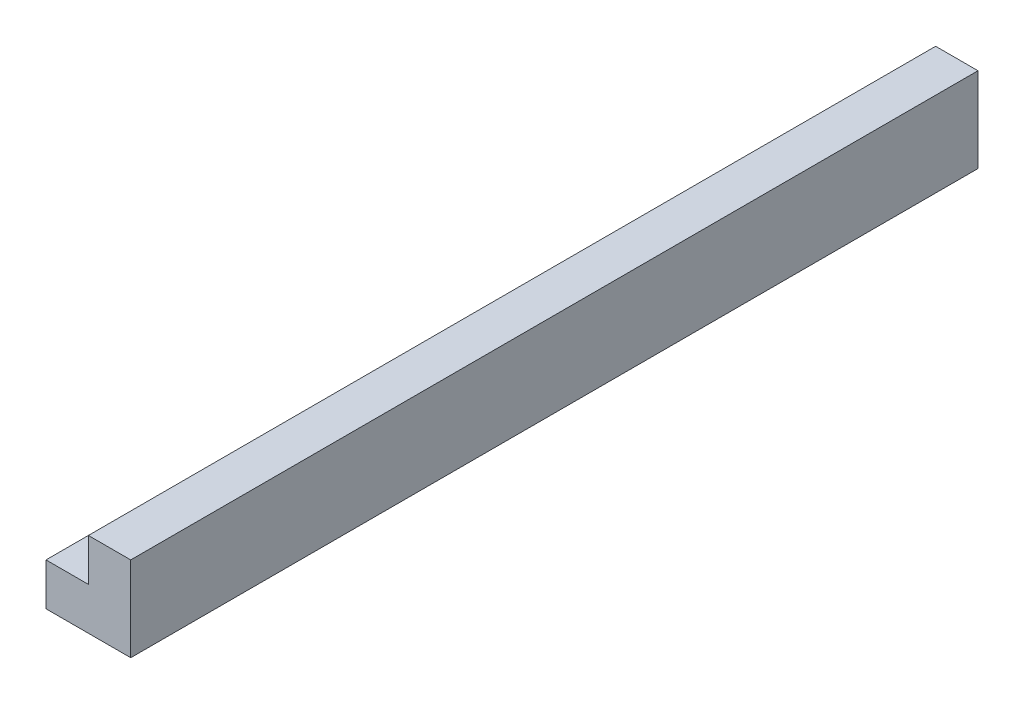
ISO-10303-21;
HEADER;
FILE_DESCRIPTION(('STEP AP214'),'2;1');
FILE_NAME('part.step','',(''),(''),'','','');
FILE_SCHEMA(('AUTOMOTIVE_DESIGN { 1 0 10303 214 1 1 1 1 }'));
ENDSEC;
DATA;
#1=APPLICATION_CONTEXT('core data for automotive mechanical design processes');
#2=APPLICATION_PROTOCOL_DEFINITION('international standard','automotive_design',2000,#1);
#3=PRODUCT_CONTEXT('',#1,'mechanical');
#4=PRODUCT('Part','Part','',(#3));
#5=PRODUCT_RELATED_PRODUCT_CATEGORY('part','',(#4));
#6=PRODUCT_DEFINITION_FORMATION('','',#4);
#7=PRODUCT_DEFINITION_CONTEXT('part definition',#1,'design');
#8=PRODUCT_DEFINITION('design','',#6,#7);
#9=PRODUCT_DEFINITION_SHAPE('','',#8);
#10=(LENGTH_UNIT() NAMED_UNIT(*) SI_UNIT(.MILLI.,.METRE.));
#11=(NAMED_UNIT(*) PLANE_ANGLE_UNIT() SI_UNIT($,.RADIAN.));
#12=(NAMED_UNIT(*) SI_UNIT($,.STERADIAN.) SOLID_ANGLE_UNIT());
#13=UNCERTAINTY_MEASURE_WITH_UNIT(LENGTH_MEASURE(1.E-05),#10,'distance_accuracy_value','');
#14=(GEOMETRIC_REPRESENTATION_CONTEXT(3) GLOBAL_UNCERTAINTY_ASSIGNED_CONTEXT((#13)) GLOBAL_UNIT_ASSIGNED_CONTEXT((#10,
#11,#12)) REPRESENTATION_CONTEXT('',''));
#15=CARTESIAN_POINT('',(0.,0.,0.));
#16=DIRECTION('',(0.,0.,1.));
#17=DIRECTION('',(1.,0.,0.));
#18=AXIS2_PLACEMENT_3D('',#15,#16,#17);
#19=CARTESIAN_POINT('',(0.,10.,200.));
#20=DIRECTION('',(1.,0.,0.));
#21=DIRECTION('',(0.,0.,-1.));
#22=AXIS2_PLACEMENT_3D('',#19,#20,#21);
#23=PLANE('',#22);
#24=DIRECTION('',(0.,-1.,0.));
#25=VECTOR('',#24,1.);
#26=CARTESIAN_POINT('',(0.,10.,0.));
#27=LINE('',#26,#25);
#28=CARTESIAN_POINT('',(0.,10.,0.));
#29=VERTEX_POINT('',#28);
#30=CARTESIAN_POINT('',(0.,0.,0.));
#31=VERTEX_POINT('',#30);
#32=EDGE_CURVE('E119',#29,#31,#27,.T.);
#33=ORIENTED_EDGE('',*,*,#32,.T.);
#34=DIRECTION('',(0.,0.,-1.));
#35=VECTOR('',#34,1.);
#36=CARTESIAN_POINT('',(0.,0.,200.));
#37=LINE('',#36,#35);
#38=CARTESIAN_POINT('',(0.,0.,200.));
#39=VERTEX_POINT('',#38);
#40=EDGE_CURVE('E11',#39,#31,#37,.T.);
#41=ORIENTED_EDGE('',*,*,#40,.F.);
#42=DIRECTION('',(0.,-1.,0.));
#43=VECTOR('',#42,1.);
#44=CARTESIAN_POINT('',(0.,10.,200.));
#45=LINE('',#44,#43);
#46=CARTESIAN_POINT('',(0.,10.,200.));
#47=VERTEX_POINT('',#46);
#48=EDGE_CURVE('E129',#47,#39,#45,.T.);
#49=ORIENTED_EDGE('',*,*,#48,.F.);
#50=DIRECTION('',(0.,0.,-1.));
#51=VECTOR('',#50,1.);
#52=CARTESIAN_POINT('',(0.,10.,200.));
#53=LINE('',#52,#51);
#54=EDGE_CURVE('E115',#47,#29,#53,.T.);
#55=ORIENTED_EDGE('',*,*,#54,.T.);
#56=EDGE_LOOP('',(#33,#41,#49,#55));
#57=FACE_BOUND('',#56,.T.);
#58=ADVANCED_FACE('F35',(#57),#23,.F.);
#59=CARTESIAN_POINT('',(0.,0.,200.));
#60=DIRECTION('',(0.,1.,0.));
#61=DIRECTION('',(0.,0.,1.));
#62=AXIS2_PLACEMENT_3D('',#59,#60,#61);
#63=PLANE('',#62);
#64=DIRECTION('',(1.,0.,0.));
#65=VECTOR('',#64,1.);
#66=CARTESIAN_POINT('',(0.,0.,0.));
#67=LINE('',#66,#65);
#68=CARTESIAN_POINT('',(20.,0.,0.));
#69=VERTEX_POINT('',#68);
#70=EDGE_CURVE('E122',#31,#69,#67,.T.);
#71=ORIENTED_EDGE('',*,*,#70,.T.);
#72=DIRECTION('',(0.,0.,-1.));
#73=VECTOR('',#72,1.);
#74=CARTESIAN_POINT('',(20.,0.,200.));
#75=LINE('',#74,#73);
#76=CARTESIAN_POINT('',(20.,0.,200.));
#77=VERTEX_POINT('',#76);
#78=EDGE_CURVE('E43',#77,#69,#75,.T.);
#79=ORIENTED_EDGE('',*,*,#78,.F.);
#80=DIRECTION('',(1.,0.,0.));
#81=VECTOR('',#80,1.);
#82=CARTESIAN_POINT('',(0.,0.,200.));
#83=LINE('',#82,#81);
#84=EDGE_CURVE('E88',#39,#77,#83,.T.);
#85=ORIENTED_EDGE('',*,*,#84,.F.);
#86=ORIENTED_EDGE('',*,*,#40,.T.);
#87=EDGE_LOOP('',(#71,#79,#85,#86));
#88=FACE_BOUND('',#87,.T.);
#89=ADVANCED_FACE('F153',(#88),#63,.F.);
#90=CARTESIAN_POINT('',(20.,0.,200.));
#91=DIRECTION('',(-1.,0.,0.));
#92=DIRECTION('',(0.,0.,1.));
#93=AXIS2_PLACEMENT_3D('',#90,#91,#92);
#94=PLANE('',#93);
#95=DIRECTION('',(0.,1.,0.));
#96=VECTOR('',#95,1.);
#97=CARTESIAN_POINT('',(20.,0.,0.));
#98=LINE('',#97,#96);
#99=CARTESIAN_POINT('',(20.,20.,0.));
#100=VERTEX_POINT('',#99);
#101=EDGE_CURVE('E124',#69,#100,#98,.T.);
#102=ORIENTED_EDGE('',*,*,#101,.T.);
#103=DIRECTION('',(0.,0.,-1.));
#104=VECTOR('',#103,1.);
#105=CARTESIAN_POINT('',(20.,20.,200.));
#106=LINE('',#105,#104);
#107=CARTESIAN_POINT('',(20.,20.,200.));
#108=VERTEX_POINT('',#107);
#109=EDGE_CURVE('E110',#108,#100,#106,.T.);
#110=ORIENTED_EDGE('',*,*,#109,.F.);
#111=DIRECTION('',(0.,1.,0.));
#112=VECTOR('',#111,1.);
#113=CARTESIAN_POINT('',(20.,0.,200.));
#114=LINE('',#113,#112);
#115=EDGE_CURVE('E101',#77,#108,#114,.T.);
#116=ORIENTED_EDGE('',*,*,#115,.F.);
#117=ORIENTED_EDGE('',*,*,#78,.T.);
#118=EDGE_LOOP('',(#102,#110,#116,#117));
#119=FACE_BOUND('',#118,.T.);
#120=ADVANCED_FACE('F135',(#119),#94,.F.);
#121=CARTESIAN_POINT('',(20.,20.,200.));
#122=DIRECTION('',(0.,-1.,0.));
#123=DIRECTION('',(0.,0.,-1.));
#124=AXIS2_PLACEMENT_3D('',#121,#122,#123);
#125=PLANE('',#124);
#126=DIRECTION('',(-1.,0.,0.));
#127=VECTOR('',#126,1.);
#128=CARTESIAN_POINT('',(20.,20.,0.));
#129=LINE('',#128,#127);
#130=CARTESIAN_POINT('',(10.,20.,0.));
#131=VERTEX_POINT('',#130);
#132=EDGE_CURVE('E109',#100,#131,#129,.T.);
#133=ORIENTED_EDGE('',*,*,#132,.T.);
#134=DIRECTION('',(0.,0.,-1.));
#135=VECTOR('',#134,1.);
#136=CARTESIAN_POINT('',(10.,20.,200.));
#137=LINE('',#136,#135);
#138=CARTESIAN_POINT('',(10.,20.,200.));
#139=VERTEX_POINT('',#138);
#140=EDGE_CURVE('E106',#139,#131,#137,.T.);
#141=ORIENTED_EDGE('',*,*,#140,.F.);
#142=DIRECTION('',(-1.,0.,0.));
#143=VECTOR('',#142,1.);
#144=CARTESIAN_POINT('',(20.,20.,200.));
#145=LINE('',#144,#143);
#146=EDGE_CURVE('E95',#108,#139,#145,.T.);
#147=ORIENTED_EDGE('',*,*,#146,.F.);
#148=ORIENTED_EDGE('',*,*,#109,.T.);
#149=EDGE_LOOP('',(#133,#141,#147,#148));
#150=FACE_BOUND('',#149,.T.);
#151=ADVANCED_FACE('F107',(#150),#125,.F.);
#152=CARTESIAN_POINT('',(10.,20.,200.));
#153=DIRECTION('',(1.,0.,0.));
#154=DIRECTION('',(0.,0.,-1.));
#155=AXIS2_PLACEMENT_3D('',#152,#153,#154);
#156=PLANE('',#155);
#157=DIRECTION('',(0.,-1.,0.));
#158=VECTOR('',#157,1.);
#159=CARTESIAN_POINT('',(10.,20.,0.));
#160=LINE('',#159,#158);
#161=CARTESIAN_POINT('',(10.,10.,0.));
#162=VERTEX_POINT('',#161);
#163=EDGE_CURVE('E74',#131,#162,#160,.T.);
#164=ORIENTED_EDGE('',*,*,#163,.T.);
#165=DIRECTION('',(0.,0.,-1.));
#166=VECTOR('',#165,1.);
#167=CARTESIAN_POINT('',(10.,10.,200.));
#168=LINE('',#167,#166);
#169=CARTESIAN_POINT('',(10.,10.,200.));
#170=VERTEX_POINT('',#169);
#171=EDGE_CURVE('E111',#170,#162,#168,.T.);
#172=ORIENTED_EDGE('',*,*,#171,.F.);
#173=DIRECTION('',(0.,-1.,0.));
#174=VECTOR('',#173,1.);
#175=CARTESIAN_POINT('',(10.,20.,200.));
#176=LINE('',#175,#174);
#177=EDGE_CURVE('E99',#139,#170,#176,.T.);
#178=ORIENTED_EDGE('',*,*,#177,.F.);
#179=ORIENTED_EDGE('',*,*,#140,.T.);
#180=EDGE_LOOP('',(#164,#172,#178,#179));
#181=FACE_BOUND('',#180,.T.);
#182=ADVANCED_FACE('F113',(#181),#156,.F.);
#183=CARTESIAN_POINT('',(10.,10.,200.));
#184=DIRECTION('',(0.,-1.,0.));
#185=DIRECTION('',(0.,0.,-1.));
#186=AXIS2_PLACEMENT_3D('',#183,#184,#185);
#187=PLANE('',#186);
#188=DIRECTION('',(-1.,0.,0.));
#189=VECTOR('',#188,1.);
#190=CARTESIAN_POINT('',(10.,10.,0.));
#191=LINE('',#190,#189);
#192=EDGE_CURVE('E80',#162,#29,#191,.T.);
#193=ORIENTED_EDGE('',*,*,#192,.T.);
#194=ORIENTED_EDGE('',*,*,#54,.F.);
#195=DIRECTION('',(-1.,0.,0.));
#196=VECTOR('',#195,1.);
#197=CARTESIAN_POINT('',(10.,10.,200.));
#198=LINE('',#197,#196);
#199=EDGE_CURVE('E51',#170,#47,#198,.T.);
#200=ORIENTED_EDGE('',*,*,#199,.F.);
#201=ORIENTED_EDGE('',*,*,#171,.T.);
#202=EDGE_LOOP('',(#193,#194,#200,#201));
#203=FACE_BOUND('',#202,.T.);
#204=ADVANCED_FACE('F142',(#203),#187,.F.);
#205=CARTESIAN_POINT('',(0.,0.,200.));
#206=DIRECTION('',(0.,0.,1.));
#207=DIRECTION('',(1.,0.,0.));
#208=AXIS2_PLACEMENT_3D('',#205,#206,#207);
#209=PLANE('',#208);
#210=ORIENTED_EDGE('',*,*,#48,.T.);
#211=ORIENTED_EDGE('',*,*,#84,.T.);
#212=ORIENTED_EDGE('',*,*,#115,.T.);
#213=ORIENTED_EDGE('',*,*,#146,.T.);
#214=ORIENTED_EDGE('',*,*,#177,.T.);
#215=ORIENTED_EDGE('',*,*,#199,.T.);
#216=EDGE_LOOP('',(#210,#211,#212,#213,#214,#215));
#217=FACE_BOUND('',#216,.T.);
#218=ADVANCED_FACE('F97',(#217),#209,.T.);
#219=CARTESIAN_POINT('',(0.,0.,0.));
#220=DIRECTION('',(0.,0.,1.));
#221=DIRECTION('',(1.,0.,0.));
#222=AXIS2_PLACEMENT_3D('',#219,#220,#221);
#223=PLANE('',#222);
#224=ORIENTED_EDGE('',*,*,#32,.F.);
#225=ORIENTED_EDGE('',*,*,#192,.F.);
#226=ORIENTED_EDGE('',*,*,#163,.F.);
#227=ORIENTED_EDGE('',*,*,#132,.F.);
#228=ORIENTED_EDGE('',*,*,#101,.F.);
#229=ORIENTED_EDGE('',*,*,#70,.F.);
#230=EDGE_LOOP('',(#224,#225,#226,#227,#228,#229));
#231=FACE_BOUND('',#230,.T.);
#232=ADVANCED_FACE('F138',(#231),#223,.F.);
#233=CLOSED_SHELL('',(#58,#89,#120,#151,#182,#204,#218,#232));
#234=MANIFOLD_SOLID_BREP('B2',#233);
#235=ADVANCED_BREP_SHAPE_REPRESENTATION('',(#18,#234),#14);
#236=SHAPE_DEFINITION_REPRESENTATION(#9,#235);
ENDSEC;
END-ISO-10303-21;
